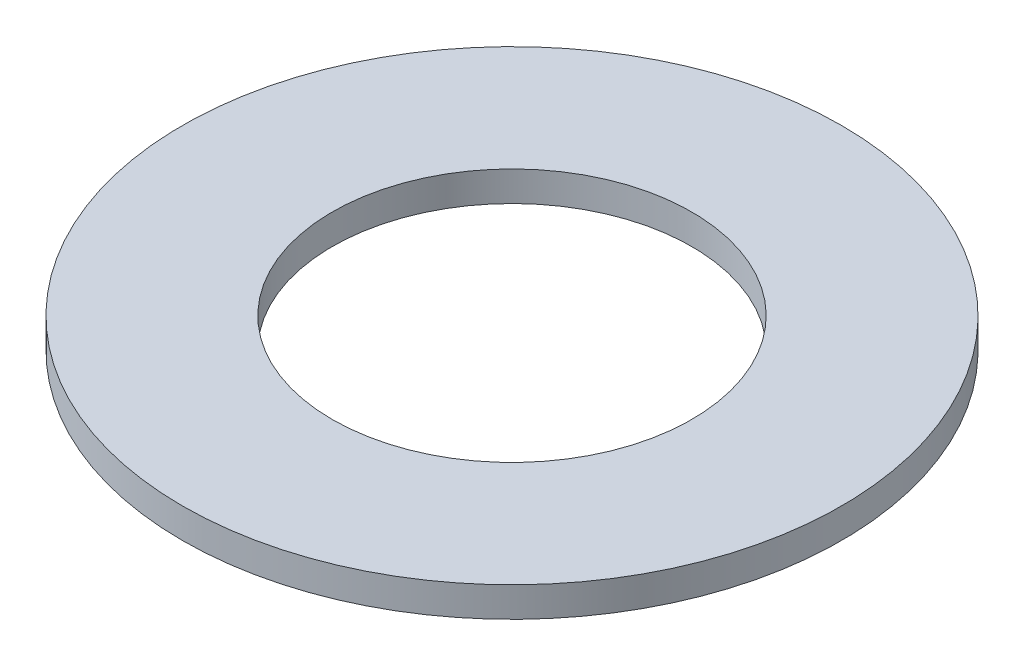
ISO-10303-21;
HEADER;
FILE_DESCRIPTION(('STEP AP214'),'2;1');
FILE_NAME('part.step','',(''),(''),'','','');
FILE_SCHEMA(('AUTOMOTIVE_DESIGN { 1 0 10303 214 1 1 1 1 }'));
ENDSEC;
DATA;
#1=APPLICATION_CONTEXT('core data for automotive mechanical design processes');
#2=APPLICATION_PROTOCOL_DEFINITION('international standard','automotive_design',2000,#1);
#3=PRODUCT_CONTEXT('',#1,'mechanical');
#4=PRODUCT('Part','Part','',(#3));
#5=PRODUCT_RELATED_PRODUCT_CATEGORY('part','',(#4));
#6=PRODUCT_DEFINITION_FORMATION('','',#4);
#7=PRODUCT_DEFINITION_CONTEXT('part definition',#1,'design');
#8=PRODUCT_DEFINITION('design','',#6,#7);
#9=PRODUCT_DEFINITION_SHAPE('','',#8);
#10=(LENGTH_UNIT() NAMED_UNIT(*) SI_UNIT(.MILLI.,.METRE.));
#11=(NAMED_UNIT(*) PLANE_ANGLE_UNIT() SI_UNIT($,.RADIAN.));
#12=(NAMED_UNIT(*) SI_UNIT($,.STERADIAN.) SOLID_ANGLE_UNIT());
#13=UNCERTAINTY_MEASURE_WITH_UNIT(LENGTH_MEASURE(1.E-05),#10,'distance_accuracy_value','');
#14=(GEOMETRIC_REPRESENTATION_CONTEXT(3) GLOBAL_UNCERTAINTY_ASSIGNED_CONTEXT((#13)) GLOBAL_UNIT_ASSIGNED_CONTEXT((#10,
#11,#12)) REPRESENTATION_CONTEXT('',''));
#15=CARTESIAN_POINT('',(0.,0.,0.));
#16=DIRECTION('',(0.,0.,1.));
#17=DIRECTION('',(1.,0.,0.));
#18=AXIS2_PLACEMENT_3D('',#15,#16,#17);
#19=CARTESIAN_POINT('',(0.,0.5,0.));
#20=DIRECTION('',(0.,1.,0.));
#21=DIRECTION('',(0.,0.,1.));
#22=AXIS2_PLACEMENT_3D('',#19,#20,#21);
#23=PLANE('',#22);
#24=CARTESIAN_POINT('',(0.,0.5,0.));
#25=DIRECTION('',(0.,1.,0.));
#26=DIRECTION('',(0.,0.,1.));
#27=AXIS2_PLACEMENT_3D('',#24,#25,#26);
#28=CIRCLE('',#27,5.5);
#29=CARTESIAN_POINT('',(0.,0.5,5.5));
#30=VERTEX_POINT('',#29);
#31=EDGE_CURVE('E10',#30,#30,#28,.T.);
#32=ORIENTED_EDGE('',*,*,#31,.T.);
#33=EDGE_LOOP('',(#32));
#34=FACE_BOUND('',#33,.T.);
#35=CARTESIAN_POINT('',(0.,0.5,0.));
#36=DIRECTION('',(0.,1.,0.));
#37=DIRECTION('',(0.,0.,1.));
#38=AXIS2_PLACEMENT_3D('',#35,#36,#37);
#39=CIRCLE('',#38,3.);
#40=CARTESIAN_POINT('',(0.,0.5,3.));
#41=VERTEX_POINT('',#40);
#42=EDGE_CURVE('E56',#41,#41,#39,.T.);
#43=ORIENTED_EDGE('',*,*,#42,.F.);
#44=EDGE_LOOP('',(#43));
#45=FACE_BOUND('',#44,.T.);
#46=ADVANCED_FACE('F43',(#34,#45),#23,.T.);
#47=CARTESIAN_POINT('',(0.,0.,0.));
#48=DIRECTION('',(0.,1.,0.));
#49=DIRECTION('',(0.,0.,1.));
#50=AXIS2_PLACEMENT_3D('',#47,#48,#49);
#51=PLANE('',#50);
#52=CARTESIAN_POINT('',(0.,0.,0.));
#53=DIRECTION('',(0.,1.,0.));
#54=DIRECTION('',(0.,0.,1.));
#55=AXIS2_PLACEMENT_3D('',#52,#53,#54);
#56=CIRCLE('',#55,5.5);
#57=CARTESIAN_POINT('',(0.,0.,5.5));
#58=VERTEX_POINT('',#57);
#59=EDGE_CURVE('E47',#58,#58,#56,.T.);
#60=ORIENTED_EDGE('',*,*,#59,.F.);
#61=EDGE_LOOP('',(#60));
#62=FACE_BOUND('',#61,.T.);
#63=CARTESIAN_POINT('',(0.,0.,0.));
#64=DIRECTION('',(0.,1.,0.));
#65=DIRECTION('',(0.,0.,1.));
#66=AXIS2_PLACEMENT_3D('',#63,#64,#65);
#67=CIRCLE('',#66,3.);
#68=CARTESIAN_POINT('',(0.,0.,3.));
#69=VERTEX_POINT('',#68);
#70=EDGE_CURVE('E58',#69,#69,#67,.T.);
#71=ORIENTED_EDGE('',*,*,#70,.T.);
#72=EDGE_LOOP('',(#71));
#73=FACE_BOUND('',#72,.T.);
#74=ADVANCED_FACE('F70',(#62,#73),#51,.F.);
#75=CARTESIAN_POINT('',(0.,0.5,0.));
#76=DIRECTION('',(0.,-1.,0.));
#77=DIRECTION('',(0.,0.,-1.));
#78=AXIS2_PLACEMENT_3D('',#75,#76,#77);
#79=CYLINDRICAL_SURFACE('',#78,5.5);
#80=ORIENTED_EDGE('',*,*,#31,.F.);
#81=EDGE_LOOP('',(#80));
#82=FACE_BOUND('',#81,.T.);
#83=ORIENTED_EDGE('',*,*,#59,.T.);
#84=EDGE_LOOP('',(#83));
#85=FACE_BOUND('',#84,.T.);
#86=ADVANCED_FACE('F45',(#82,#85),#79,.T.);
#87=CARTESIAN_POINT('',(0.,0.5,0.));
#88=DIRECTION('',(0.,-1.,0.));
#89=DIRECTION('',(0.,0.,-1.));
#90=AXIS2_PLACEMENT_3D('',#87,#88,#89);
#91=CYLINDRICAL_SURFACE('',#90,3.);
#92=ORIENTED_EDGE('',*,*,#42,.T.);
#93=EDGE_LOOP('',(#92));
#94=FACE_BOUND('',#93,.T.);
#95=ORIENTED_EDGE('',*,*,#70,.F.);
#96=EDGE_LOOP('',(#95));
#97=FACE_BOUND('',#96,.T.);
#98=ADVANCED_FACE('F66',(#94,#97),#91,.F.);
#99=CLOSED_SHELL('',(#46,#74,#86,#98));
#100=MANIFOLD_SOLID_BREP('B2',#99);
#101=ADVANCED_BREP_SHAPE_REPRESENTATION('',(#18,#100),#14);
#102=SHAPE_DEFINITION_REPRESENTATION(#9,#101);
ENDSEC;
END-ISO-10303-21;
